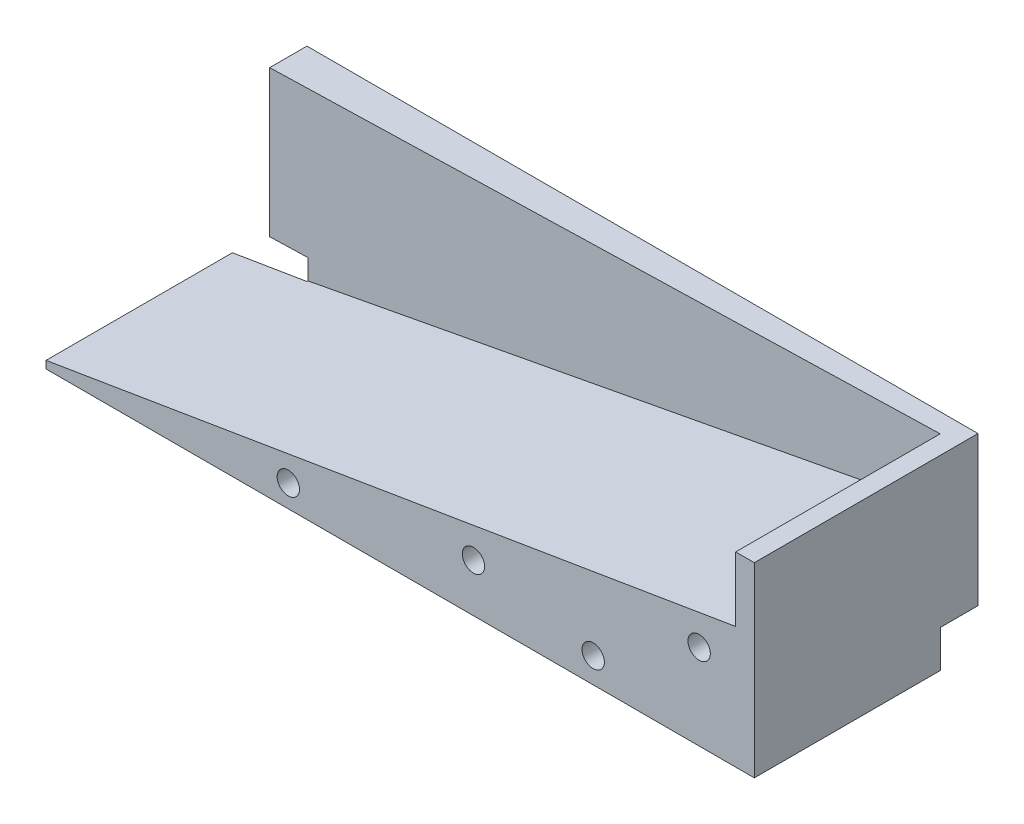
ISO-10303-21;
HEADER;
FILE_DESCRIPTION(('STEP AP214'),'2;1');
FILE_NAME('part.step','',(''),(''),'','','');
FILE_SCHEMA(('AUTOMOTIVE_DESIGN { 1 0 10303 214 1 1 1 1 }'));
ENDSEC;
DATA;
#1=APPLICATION_CONTEXT('core data for automotive mechanical design processes');
#2=APPLICATION_PROTOCOL_DEFINITION('international standard','automotive_design',2000,#1);
#3=PRODUCT_CONTEXT('',#1,'mechanical');
#4=PRODUCT('Part','Part','',(#3));
#5=PRODUCT_RELATED_PRODUCT_CATEGORY('part','',(#4));
#6=PRODUCT_DEFINITION_FORMATION('','',#4);
#7=PRODUCT_DEFINITION_CONTEXT('part definition',#1,'design');
#8=PRODUCT_DEFINITION('design','',#6,#7);
#9=PRODUCT_DEFINITION_SHAPE('','',#8);
#10=(LENGTH_UNIT() NAMED_UNIT(*) SI_UNIT(.MILLI.,.METRE.));
#11=(NAMED_UNIT(*) PLANE_ANGLE_UNIT() SI_UNIT($,.RADIAN.));
#12=(NAMED_UNIT(*) SI_UNIT($,.STERADIAN.) SOLID_ANGLE_UNIT());
#13=UNCERTAINTY_MEASURE_WITH_UNIT(LENGTH_MEASURE(1.E-05),#10,'distance_accuracy_value','');
#14=(GEOMETRIC_REPRESENTATION_CONTEXT(3) GLOBAL_UNCERTAINTY_ASSIGNED_CONTEXT((#13)) GLOBAL_UNIT_ASSIGNED_CONTEXT((#10,
#11,#12)) REPRESENTATION_CONTEXT('',''));
#15=CARTESIAN_POINT('',(0.,0.,0.));
#16=DIRECTION('',(0.,0.,1.));
#17=DIRECTION('',(1.,0.,0.));
#18=AXIS2_PLACEMENT_3D('',#15,#16,#17);
#19=CARTESIAN_POINT('',(-40.7960134047091,6.,200.));
#20=DIRECTION('',(0.,0.,-1.));
#21=DIRECTION('',(-1.,0.,0.));
#22=AXIS2_PLACEMENT_3D('',#19,#20,#21);
#23=CYLINDRICAL_SURFACE('',#22,3.);
#24=CARTESIAN_POINT('',(-40.7960134047091,6.,55.));
#25=DIRECTION('',(0.,0.,-1.));
#26=DIRECTION('',(-1.,0.,0.));
#27=AXIS2_PLACEMENT_3D('',#24,#25,#26);
#28=CIRCLE('',#27,3.);
#29=CARTESIAN_POINT('',(-43.7960134047091,6.,55.));
#30=VERTEX_POINT('',#29);
#31=EDGE_CURVE('E289',#30,#30,#28,.T.);
#32=ORIENTED_EDGE('',*,*,#31,.F.);
#33=EDGE_LOOP('',(#32));
#34=FACE_BOUND('',#33,.T.);
#35=CARTESIAN_POINT('',(-40.7960134047091,6.,10.));
#36=DIRECTION('',(0.,0.,-1.));
#37=DIRECTION('',(-1.,0.,0.));
#38=AXIS2_PLACEMENT_3D('',#35,#36,#37);
#39=CIRCLE('',#38,3.);
#40=CARTESIAN_POINT('',(-43.7960134047091,6.,10.));
#41=VERTEX_POINT('',#40);
#42=EDGE_CURVE('E190',#41,#41,#39,.T.);
#43=ORIENTED_EDGE('',*,*,#42,.T.);
#44=EDGE_LOOP('',(#43));
#45=FACE_BOUND('',#44,.T.);
#46=ADVANCED_FACE('F35',(#34,#45),#23,.F.);
#47=CARTESIAN_POINT('',(8.86154286614935,12.9010851063287,200.));
#48=DIRECTION('',(0.,0.,-1.));
#49=DIRECTION('',(-1.,0.,0.));
#50=AXIS2_PLACEMENT_3D('',#47,#48,#49);
#51=CYLINDRICAL_SURFACE('',#50,3.);
#52=CARTESIAN_POINT('',(8.86154286614935,12.9010851063287,55.));
#53=DIRECTION('',(0.,0.,-1.));
#54=DIRECTION('',(-1.,0.,0.));
#55=AXIS2_PLACEMENT_3D('',#52,#53,#54);
#56=CIRCLE('',#55,3.);
#57=CARTESIAN_POINT('',(5.86154286614935,12.9010851063287,55.));
#58=VERTEX_POINT('',#57);
#59=EDGE_CURVE('E429',#58,#58,#56,.T.);
#60=ORIENTED_EDGE('',*,*,#59,.F.);
#61=EDGE_LOOP('',(#60));
#62=FACE_BOUND('',#61,.T.);
#63=CARTESIAN_POINT('',(8.86154286614935,12.9010851063287,10.));
#64=DIRECTION('',(0.,0.,-1.));
#65=DIRECTION('',(-1.,0.,0.));
#66=AXIS2_PLACEMENT_3D('',#63,#64,#65);
#67=CIRCLE('',#66,3.);
#68=CARTESIAN_POINT('',(5.86154286614935,12.9010851063287,10.));
#69=VERTEX_POINT('',#68);
#70=EDGE_CURVE('E185',#69,#69,#67,.T.);
#71=ORIENTED_EDGE('',*,*,#70,.T.);
#72=EDGE_LOOP('',(#71));
#73=FACE_BOUND('',#72,.T.);
#74=ADVANCED_FACE('F322',(#62,#73),#51,.F.);
#75=CARTESIAN_POINT('',(40.9814690667464,6.77616521020496,200.));
#76=DIRECTION('',(0.,0.,-1.));
#77=DIRECTION('',(-1.,0.,0.));
#78=AXIS2_PLACEMENT_3D('',#75,#76,#77);
#79=CYLINDRICAL_SURFACE('',#78,3.00000000000001);
#80=CARTESIAN_POINT('',(40.9814690667464,6.77616521020496,55.));
#81=DIRECTION('',(0.,0.,-1.));
#82=DIRECTION('',(-1.,0.,0.));
#83=AXIS2_PLACEMENT_3D('',#80,#81,#82);
#84=CIRCLE('',#83,3.00000000000001);
#85=CARTESIAN_POINT('',(37.9814690667464,6.77616521020496,55.));
#86=VERTEX_POINT('',#85);
#87=EDGE_CURVE('E433',#86,#86,#84,.T.);
#88=ORIENTED_EDGE('',*,*,#87,.F.);
#89=EDGE_LOOP('',(#88));
#90=FACE_BOUND('',#89,.T.);
#91=CARTESIAN_POINT('',(40.9814690667464,6.77616521020496,10.));
#92=DIRECTION('',(0.,0.,-1.));
#93=DIRECTION('',(-1.,0.,0.));
#94=AXIS2_PLACEMENT_3D('',#91,#92,#93);
#95=CIRCLE('',#94,3.00000000000001);
#96=CARTESIAN_POINT('',(37.9814690667464,6.77616521020496,10.));
#97=VERTEX_POINT('',#96);
#98=EDGE_CURVE('E180',#97,#97,#95,.T.);
#99=ORIENTED_EDGE('',*,*,#98,.T.);
#100=EDGE_LOOP('',(#99));
#101=FACE_BOUND('',#100,.T.);
#102=ADVANCED_FACE('F329',(#90,#101),#79,.F.);
#103=CARTESIAN_POINT('',(69.4060048708337,22.9393971638675,200.));
#104=DIRECTION('',(0.,0.,-1.));
#105=DIRECTION('',(-1.,0.,0.));
#106=AXIS2_PLACEMENT_3D('',#103,#104,#105);
#107=CYLINDRICAL_SURFACE('',#106,3.00000000000001);
#108=CARTESIAN_POINT('',(69.4060048708337,22.9393971638675,55.));
#109=DIRECTION('',(0.,0.,-1.));
#110=DIRECTION('',(-1.,0.,0.));
#111=AXIS2_PLACEMENT_3D('',#108,#109,#110);
#112=CIRCLE('',#111,3.00000000000001);
#113=CARTESIAN_POINT('',(66.4060048708336,22.9393971638675,55.));
#114=VERTEX_POINT('',#113);
#115=EDGE_CURVE('E436',#114,#114,#112,.T.);
#116=ORIENTED_EDGE('',*,*,#115,.F.);
#117=EDGE_LOOP('',(#116));
#118=FACE_BOUND('',#117,.T.);
#119=CARTESIAN_POINT('',(69.4060048708337,22.9393971638675,10.));
#120=DIRECTION('',(0.,0.,-1.));
#121=DIRECTION('',(-1.,0.,0.));
#122=AXIS2_PLACEMENT_3D('',#119,#120,#121);
#123=CIRCLE('',#122,3.00000000000001);
#124=CARTESIAN_POINT('',(66.4060048708336,22.9393971638675,10.));
#125=VERTEX_POINT('',#124);
#126=EDGE_CURVE('E175',#125,#125,#123,.T.);
#127=ORIENTED_EDGE('',*,*,#126,.T.);
#128=EDGE_LOOP('',(#127));
#129=FACE_BOUND('',#128,.T.);
#130=ADVANCED_FACE('F337',(#118,#129),#107,.F.);
#131=CARTESIAN_POINT('',(-105.796013404709,2.,200.));
#132=DIRECTION('',(0.163567680624933,-0.986532114963816,0.));
#133=DIRECTION('',(0.986532114963816,0.163567680624933,0.));
#134=AXIS2_PLACEMENT_3D('',#131,#132,#133);
#135=PLANE('',#134);
#136=DIRECTION('',(0.,0.,-1.));
#137=VECTOR('',#136,1.);
#138=CARTESIAN_POINT('',(-105.796013404709,2.,200.));
#139=LINE('',#138,#137);
#140=CARTESIAN_POINT('',(-105.796013404709,2.,55.));
#141=VERTEX_POINT('',#140);
#142=CARTESIAN_POINT('',(-105.796013404709,2.,5.));
#143=VERTEX_POINT('',#142);
#144=EDGE_CURVE('E158',#141,#143,#139,.T.);
#145=ORIENTED_EDGE('',*,*,#144,.F.);
#146=DIRECTION('',(0.986532114963816,0.163567680624933,0.));
#147=VECTOR('',#146,1.);
#148=CARTESIAN_POINT('',(-105.796013404709,2.,55.));
#149=LINE('',#148,#147);
#150=CARTESIAN_POINT('',(79.2039865952909,32.6731230100121,55.));
#151=VERTEX_POINT('',#150);
#152=EDGE_CURVE('E437',#141,#151,#149,.T.);
#153=ORIENTED_EDGE('',*,*,#152,.T.);
#154=DIRECTION('',(0.,0.,-1.));
#155=VECTOR('',#154,1.);
#156=CARTESIAN_POINT('',(79.2039865952909,32.6731230100121,217.967909160371));
#157=LINE('',#156,#155);
#158=CARTESIAN_POINT('',(79.2039865952909,32.6731230100121,0.138888888888883));
#159=VERTEX_POINT('',#158);
#160=EDGE_CURVE('E284',#151,#159,#157,.T.);
#161=ORIENTED_EDGE('',*,*,#160,.T.);
#162=DIRECTION('',(-0.986161899831777,-0.163506298709877,0.0273933861064383));
#163=VECTOR('',#162,1.);
#164=CARTESIAN_POINT('',(-111.056300597368,1.12784088579239,5.42389686646275));
#165=LINE('',#164,#163);
#166=CARTESIAN_POINT('',(-85.7960134047091,5.31601329837969,4.72222222222223));
#167=VERTEX_POINT('',#166);
#168=EDGE_CURVE('E195',#159,#167,#165,.T.);
#169=ORIENTED_EDGE('',*,*,#168,.T.);
#170=DIRECTION('',(0.,0.,1.));
#171=VECTOR('',#170,1.);
#172=CARTESIAN_POINT('',(-85.7960134047091,5.31601329837969,200.));
#173=LINE('',#172,#171);
#174=CARTESIAN_POINT('',(-85.7960134047091,5.31601329837969,5.));
#175=VERTEX_POINT('',#174);
#176=EDGE_CURVE('E266',#167,#175,#173,.T.);
#177=ORIENTED_EDGE('',*,*,#176,.T.);
#178=DIRECTION('',(0.986532114963816,0.163567680624933,0.));
#179=VECTOR('',#178,1.);
#180=CARTESIAN_POINT('',(-105.796013404709,2.,5.));
#181=LINE('',#180,#179);
#182=EDGE_CURVE('E261',#143,#175,#181,.T.);
#183=ORIENTED_EDGE('',*,*,#182,.F.);
#184=EDGE_LOOP('',(#145,#153,#161,#169,#177,#183));
#185=FACE_BOUND('',#184,.T.);
#186=ADVANCED_FACE('F341',(#185),#135,.F.);
#187=CARTESIAN_POINT('',(-105.796013404709,0.,200.));
#188=DIRECTION('',(1.,0.,0.));
#189=DIRECTION('',(0.,0.,-1.));
#190=AXIS2_PLACEMENT_3D('',#187,#188,#189);
#191=PLANE('',#190);
#192=DIRECTION('',(0.,0.,-1.));
#193=VECTOR('',#192,1.);
#194=CARTESIAN_POINT('',(-105.796013404709,0.,200.));
#195=LINE('',#194,#193);
#196=CARTESIAN_POINT('',(-105.796013404709,0.,55.));
#197=VERTEX_POINT('',#196);
#198=CARTESIAN_POINT('',(-105.796013404709,0.,5.));
#199=VERTEX_POINT('',#198);
#200=EDGE_CURVE('E168',#197,#199,#195,.T.);
#201=ORIENTED_EDGE('',*,*,#200,.F.);
#202=DIRECTION('',(0.,1.,0.));
#203=VECTOR('',#202,1.);
#204=CARTESIAN_POINT('',(-105.796013404709,-242.074368738204,55.));
#205=LINE('',#204,#203);
#206=EDGE_CURVE('E142',#197,#141,#205,.T.);
#207=ORIENTED_EDGE('',*,*,#206,.T.);
#208=ORIENTED_EDGE('',*,*,#144,.T.);
#209=DIRECTION('',(0.,1.,0.));
#210=VECTOR('',#209,1.);
#211=CARTESIAN_POINT('',(-105.796013404709,0.,5.));
#212=LINE('',#211,#210);
#213=EDGE_CURVE('E248',#199,#143,#212,.T.);
#214=ORIENTED_EDGE('',*,*,#213,.F.);
#215=EDGE_LOOP('',(#201,#207,#208,#214));
#216=FACE_BOUND('',#215,.T.);
#217=ADVANCED_FACE('F37',(#216),#191,.F.);
#218=CARTESIAN_POINT('',(-105.796013404709,0.,200.));
#219=DIRECTION('',(0.,1.,0.));
#220=DIRECTION('',(0.,0.,1.));
#221=AXIS2_PLACEMENT_3D('',#218,#219,#220);
#222=PLANE('',#221);
#223=DIRECTION('',(0.,0.,-1.));
#224=VECTOR('',#223,1.);
#225=CARTESIAN_POINT('',(84.2039865952909,0.,200.));
#226=LINE('',#225,#224);
#227=CARTESIAN_POINT('',(84.2039865952909,0.,55.));
#228=VERTEX_POINT('',#227);
#229=CARTESIAN_POINT('',(84.2039865952909,0.,5.));
#230=VERTEX_POINT('',#229);
#231=EDGE_CURVE('E161',#228,#230,#226,.T.);
#232=ORIENTED_EDGE('',*,*,#231,.F.);
#233=DIRECTION('',(1.,0.,0.));
#234=VECTOR('',#233,1.);
#235=CARTESIAN_POINT('',(84.2039865952909,0.,55.));
#236=LINE('',#235,#234);
#237=EDGE_CURVE('E138',#197,#228,#236,.T.);
#238=ORIENTED_EDGE('',*,*,#237,.F.);
#239=ORIENTED_EDGE('',*,*,#200,.T.);
#240=DIRECTION('',(-1.,0.,0.));
#241=VECTOR('',#240,1.);
#242=CARTESIAN_POINT('',(-105.796013404709,0.,5.));
#243=LINE('',#242,#241);
#244=CARTESIAN_POINT('',(-85.7960134047091,0.,5.));
#245=VERTEX_POINT('',#244);
#246=EDGE_CURVE('E253',#245,#199,#243,.T.);
#247=ORIENTED_EDGE('',*,*,#246,.F.);
#248=DIRECTION('',(0.,0.,-1.));
#249=VECTOR('',#248,1.);
#250=CARTESIAN_POINT('',(-85.7960134047091,0.,5.));
#251=LINE('',#250,#249);
#252=CARTESIAN_POINT('',(-85.7960134047091,0.,-5.));
#253=VERTEX_POINT('',#252);
#254=EDGE_CURVE('E217',#245,#253,#251,.T.);
#255=ORIENTED_EDGE('',*,*,#254,.T.);
#256=DIRECTION('',(1.,0.,0.));
#257=VECTOR('',#256,1.);
#258=CARTESIAN_POINT('',(-95.7960134047091,0.,-5.));
#259=LINE('',#258,#257);
#260=CARTESIAN_POINT('',(74.2039865952908,0.,-5.));
#261=VERTEX_POINT('',#260);
#262=EDGE_CURVE('E163',#253,#261,#259,.T.);
#263=ORIENTED_EDGE('',*,*,#262,.T.);
#264=DIRECTION('',(0.,0.,-1.));
#265=VECTOR('',#264,1.);
#266=CARTESIAN_POINT('',(74.2039865952909,0.,-5.));
#267=LINE('',#266,#265);
#268=CARTESIAN_POINT('',(74.2039865952909,0.,5.));
#269=VERTEX_POINT('',#268);
#270=EDGE_CURVE('E57',#269,#261,#267,.T.);
#271=ORIENTED_EDGE('',*,*,#270,.F.);
#272=DIRECTION('',(1.,0.,0.));
#273=VECTOR('',#272,1.);
#274=CARTESIAN_POINT('',(74.2039865952909,0.,5.));
#275=LINE('',#274,#273);
#276=EDGE_CURVE('E242',#269,#230,#275,.T.);
#277=ORIENTED_EDGE('',*,*,#276,.T.);
#278=EDGE_LOOP('',(#232,#238,#239,#247,#255,#263,#271,#277));
#279=FACE_BOUND('',#278,.T.);
#280=ADVANCED_FACE('F213',(#279),#222,.F.);
#281=CARTESIAN_POINT('',(84.2039865952909,0.,200.));
#282=DIRECTION('',(-1.,0.,0.));
#283=DIRECTION('',(0.,0.,1.));
#284=AXIS2_PLACEMENT_3D('',#281,#282,#283);
#285=PLANE('',#284);
#286=DIRECTION('',(0.,0.,1.));
#287=VECTOR('',#286,1.);
#288=CARTESIAN_POINT('',(84.2039865952909,50.,200.));
#289=LINE('',#288,#287);
#290=CARTESIAN_POINT('',(84.2039865952909,50.,-5.));
#291=VERTEX_POINT('',#290);
#292=CARTESIAN_POINT('',(84.2039865952909,50.,55.));
#293=VERTEX_POINT('',#292);
#294=EDGE_CURVE('E148',#291,#293,#289,.T.);
#295=ORIENTED_EDGE('',*,*,#294,.T.);
#296=DIRECTION('',(0.,1.,0.));
#297=VECTOR('',#296,1.);
#298=CARTESIAN_POINT('',(84.2039865952909,-242.074368738204,55.));
#299=LINE('',#298,#297);
#300=EDGE_CURVE('E135',#228,#293,#299,.T.);
#301=ORIENTED_EDGE('',*,*,#300,.F.);
#302=ORIENTED_EDGE('',*,*,#231,.T.);
#303=DIRECTION('',(0.,-1.,0.));
#304=VECTOR('',#303,1.);
#305=CARTESIAN_POINT('',(84.2039865952909,0.,5.));
#306=LINE('',#305,#304);
#307=CARTESIAN_POINT('',(84.2039865952909,10.,5.));
#308=VERTEX_POINT('',#307);
#309=EDGE_CURVE('E229',#308,#230,#306,.T.);
#310=ORIENTED_EDGE('',*,*,#309,.F.);
#311=DIRECTION('',(0.,0.,1.));
#312=VECTOR('',#311,1.);
#313=CARTESIAN_POINT('',(84.2039865952909,10.,-5.));
#314=LINE('',#313,#312);
#315=CARTESIAN_POINT('',(84.2039865952909,10.,-5.));
#316=VERTEX_POINT('',#315);
#317=EDGE_CURVE('E178',#316,#308,#314,.T.);
#318=ORIENTED_EDGE('',*,*,#317,.F.);
#319=DIRECTION('',(0.,1.,0.));
#320=VECTOR('',#319,1.);
#321=CARTESIAN_POINT('',(84.2039865952909,0.,-5.));
#322=LINE('',#321,#320);
#323=EDGE_CURVE('E156',#316,#291,#322,.T.);
#324=ORIENTED_EDGE('',*,*,#323,.T.);
#325=EDGE_LOOP('',(#295,#301,#302,#310,#318,#324));
#326=FACE_BOUND('',#325,.T.);
#327=ADVANCED_FACE('F153',(#326),#285,.F.);
#328=CARTESIAN_POINT('',(-95.7960134047091,50.,200.));
#329=DIRECTION('',(0.,1.,0.));
#330=DIRECTION('',(0.,0.,1.));
#331=AXIS2_PLACEMENT_3D('',#328,#329,#330);
#332=PLANE('',#331);
#333=DIRECTION('',(-1.,0.,0.));
#334=VECTOR('',#333,1.);
#335=CARTESIAN_POINT('',(84.2039865952909,50.,55.));
#336=LINE('',#335,#334);
#337=CARTESIAN_POINT('',(79.2039865952909,50.,55.));
#338=VERTEX_POINT('',#337);
#339=EDGE_CURVE('E49',#293,#338,#336,.T.);
#340=ORIENTED_EDGE('',*,*,#339,.F.);
#341=ORIENTED_EDGE('',*,*,#294,.F.);
#342=DIRECTION('',(1.,0.,0.));
#343=VECTOR('',#342,1.);
#344=CARTESIAN_POINT('',(-95.7960134047091,50.,-5.));
#345=LINE('',#344,#343);
#346=CARTESIAN_POINT('',(-95.7960134047091,50.,-5.));
#347=VERTEX_POINT('',#346);
#348=EDGE_CURVE('E159',#347,#291,#345,.T.);
#349=ORIENTED_EDGE('',*,*,#348,.F.);
#350=DIRECTION('',(0.,0.,1.));
#351=VECTOR('',#350,1.);
#352=CARTESIAN_POINT('',(-95.7960134047091,50.,0.));
#353=LINE('',#352,#351);
#354=CARTESIAN_POINT('',(-95.7960134047091,50.,5.));
#355=VERTEX_POINT('',#354);
#356=EDGE_CURVE('E204',#347,#355,#353,.T.);
#357=ORIENTED_EDGE('',*,*,#356,.T.);
#358=DIRECTION('',(0.999614420652718,0.,-0.0277670672403533));
#359=VECTOR('',#358,1.);
#360=CARTESIAN_POINT('',(-95.7960134047091,50.,5.));
#361=LINE('',#360,#359);
#362=CARTESIAN_POINT('',(79.2039865952909,50.,0.138888888888885));
#363=VERTEX_POINT('',#362);
#364=EDGE_CURVE('E268',#355,#363,#361,.T.);
#365=ORIENTED_EDGE('',*,*,#364,.T.);
#366=DIRECTION('',(0.,0.,-1.));
#367=VECTOR('',#366,1.);
#368=CARTESIAN_POINT('',(79.2039865952909,50.,217.967909160371));
#369=LINE('',#368,#367);
#370=EDGE_CURVE('E151',#338,#363,#369,.T.);
#371=ORIENTED_EDGE('',*,*,#370,.F.);
#372=EDGE_LOOP('',(#340,#341,#349,#357,#365,#371));
#373=FACE_BOUND('',#372,.T.);
#374=ADVANCED_FACE('F146',(#373),#332,.T.);
#375=CARTESIAN_POINT('',(-95.7960134047091,0.,0.));
#376=DIRECTION('',(-1.,0.,0.));
#377=DIRECTION('',(0.,0.,1.));
#378=AXIS2_PLACEMENT_3D('',#375,#376,#377);
#379=PLANE('',#378);
#380=DIRECTION('',(0.,0.,-1.));
#381=VECTOR('',#380,1.);
#382=CARTESIAN_POINT('',(-95.7960134047091,10.7198341627884,0.));
#383=LINE('',#382,#381);
#384=CARTESIAN_POINT('',(-95.7960134047091,10.7198341627884,5.));
#385=VERTEX_POINT('',#384);
#386=CARTESIAN_POINT('',(-95.7960134047091,10.7198341627884,-5.));
#387=VERTEX_POINT('',#386);
#388=EDGE_CURVE('E264',#385,#387,#383,.T.);
#389=ORIENTED_EDGE('',*,*,#388,.F.);
#390=DIRECTION('',(0.,1.,0.));
#391=VECTOR('',#390,1.);
#392=CARTESIAN_POINT('',(-95.7960134047091,-180.069431053691,5.));
#393=LINE('',#392,#391);
#394=EDGE_CURVE('E197',#385,#355,#393,.T.);
#395=ORIENTED_EDGE('',*,*,#394,.T.);
#396=ORIENTED_EDGE('',*,*,#356,.F.);
#397=DIRECTION('',(0.,1.,0.));
#398=VECTOR('',#397,1.);
#399=CARTESIAN_POINT('',(-95.7960134047091,0.,-5.));
#400=LINE('',#399,#398);
#401=EDGE_CURVE('E202',#387,#347,#400,.T.);
#402=ORIENTED_EDGE('',*,*,#401,.F.);
#403=EDGE_LOOP('',(#389,#395,#396,#402));
#404=FACE_BOUND('',#403,.T.);
#405=ADVANCED_FACE('F272',(#404),#379,.T.);
#406=CARTESIAN_POINT('',(-95.7960134047091,0.,-5.));
#407=DIRECTION('',(0.,0.,-1.));
#408=DIRECTION('',(-1.,0.,0.));
#409=AXIS2_PLACEMENT_3D('',#406,#407,#408);
#410=PLANE('',#409);
#411=ORIENTED_EDGE('',*,*,#348,.T.);
#412=ORIENTED_EDGE('',*,*,#323,.F.);
#413=DIRECTION('',(1.,0.,0.));
#414=VECTOR('',#413,1.);
#415=CARTESIAN_POINT('',(74.2039865952909,10.,-5.));
#416=LINE('',#415,#414);
#417=CARTESIAN_POINT('',(74.2039865952909,10.,-5.));
#418=VERTEX_POINT('',#417);
#419=EDGE_CURVE('E226',#418,#316,#416,.T.);
#420=ORIENTED_EDGE('',*,*,#419,.F.);
#421=DIRECTION('',(0.,1.,0.));
#422=VECTOR('',#421,1.);
#423=CARTESIAN_POINT('',(74.2039865952909,0.,-5.));
#424=LINE('',#423,#422);
#425=EDGE_CURVE('E225',#261,#418,#424,.T.);
#426=ORIENTED_EDGE('',*,*,#425,.F.);
#427=ORIENTED_EDGE('',*,*,#262,.F.);
#428=DIRECTION('',(0.,-1.,0.));
#429=VECTOR('',#428,1.);
#430=CARTESIAN_POINT('',(-85.7960134047091,0.,-5.));
#431=LINE('',#430,#429);
#432=CARTESIAN_POINT('',(-85.7960134047091,10.7198341627884,-5.));
#433=VERTEX_POINT('',#432);
#434=EDGE_CURVE('E223',#433,#253,#431,.T.);
#435=ORIENTED_EDGE('',*,*,#434,.F.);
#436=DIRECTION('',(1.,0.,0.));
#437=VECTOR('',#436,1.);
#438=CARTESIAN_POINT('',(-105.796013404709,10.7198341627884,-5.));
#439=LINE('',#438,#437);
#440=EDGE_CURVE('E244',#387,#433,#439,.T.);
#441=ORIENTED_EDGE('',*,*,#440,.F.);
#442=ORIENTED_EDGE('',*,*,#401,.T.);
#443=EDGE_LOOP('',(#411,#412,#420,#426,#427,#435,#441,#442));
#444=FACE_BOUND('',#443,.T.);
#445=CARTESIAN_POINT('',(-40.7960134047091,6.,-5.));
#446=DIRECTION('',(0.,0.,-1.));
#447=DIRECTION('',(-1.,0.,0.));
#448=AXIS2_PLACEMENT_3D('',#445,#446,#447);
#449=CIRCLE('',#448,5.);
#450=CARTESIAN_POINT('',(-45.7960134047091,6.,-5.));
#451=VERTEX_POINT('',#450);
#452=EDGE_CURVE('E285',#451,#451,#449,.T.);
#453=ORIENTED_EDGE('',*,*,#452,.F.);
#454=EDGE_LOOP('',(#453));
#455=FACE_BOUND('',#454,.T.);
#456=CARTESIAN_POINT('',(8.86154286614935,12.9010851063287,-5.));
#457=DIRECTION('',(0.,0.,-1.));
#458=DIRECTION('',(-1.,0.,0.));
#459=AXIS2_PLACEMENT_3D('',#456,#457,#458);
#460=CIRCLE('',#459,5.);
#461=CARTESIAN_POINT('',(3.86154286614935,12.9010851063287,-5.));
#462=VERTEX_POINT('',#461);
#463=EDGE_CURVE('E193',#462,#462,#460,.T.);
#464=ORIENTED_EDGE('',*,*,#463,.F.);
#465=EDGE_LOOP('',(#464));
#466=FACE_BOUND('',#465,.T.);
#467=CARTESIAN_POINT('',(40.9814690667464,6.77616521020496,-5.));
#468=DIRECTION('',(0.,0.,-1.));
#469=DIRECTION('',(-1.,0.,0.));
#470=AXIS2_PLACEMENT_3D('',#467,#468,#469);
#471=CIRCLE('',#470,5.);
#472=CARTESIAN_POINT('',(35.9814690667464,6.77616521020496,-5.));
#473=VERTEX_POINT('',#472);
#474=EDGE_CURVE('E188',#473,#473,#471,.T.);
#475=ORIENTED_EDGE('',*,*,#474,.F.);
#476=EDGE_LOOP('',(#475));
#477=FACE_BOUND('',#476,.T.);
#478=CARTESIAN_POINT('',(69.4060048708337,22.9393971638675,-5.));
#479=DIRECTION('',(0.,0.,-1.));
#480=DIRECTION('',(-1.,0.,0.));
#481=AXIS2_PLACEMENT_3D('',#478,#479,#480);
#482=CIRCLE('',#481,5.);
#483=CARTESIAN_POINT('',(64.4060048708336,22.9393971638675,-5.));
#484=VERTEX_POINT('',#483);
#485=EDGE_CURVE('E183',#484,#484,#482,.T.);
#486=ORIENTED_EDGE('',*,*,#485,.F.);
#487=EDGE_LOOP('',(#486));
#488=FACE_BOUND('',#487,.T.);
#489=ADVANCED_FACE('F220',(#444,#455,#466,#477,#488),#410,.T.);
#490=CARTESIAN_POINT('',(-95.7960134047091,-180.069431053691,5.));
#491=DIRECTION('',(0.0277670672403533,0.,0.999614420652718));
#492=DIRECTION('',(0.999614420652718,0.,-0.0277670672403533));
#493=AXIS2_PLACEMENT_3D('',#490,#491,#492);
#494=PLANE('',#493);
#495=DIRECTION('',(0.,-1.,0.));
#496=VECTOR('',#495,1.);
#497=CARTESIAN_POINT('',(79.2039865952909,-180.069431053691,0.138888888888888));
#498=LINE('',#497,#496);
#499=EDGE_CURVE('E43',#363,#159,#498,.T.);
#500=ORIENTED_EDGE('',*,*,#499,.F.);
#501=ORIENTED_EDGE('',*,*,#364,.F.);
#502=ORIENTED_EDGE('',*,*,#394,.F.);
#503=DIRECTION('',(-0.999614420652718,0.,0.0277670672403533));
#504=VECTOR('',#503,1.);
#505=CARTESIAN_POINT('',(-95.7960134047091,10.7198341627884,5.));
#506=LINE('',#505,#504);
#507=CARTESIAN_POINT('',(-85.7960134047091,10.7198341627884,4.72222222222222));
#508=VERTEX_POINT('',#507);
#509=EDGE_CURVE('E170',#508,#385,#506,.T.);
#510=ORIENTED_EDGE('',*,*,#509,.F.);
#511=DIRECTION('',(0.,1.,0.));
#512=VECTOR('',#511,1.);
#513=CARTESIAN_POINT('',(-85.7960134047091,-180.069431053691,4.72222222222222));
#514=LINE('',#513,#512);
#515=EDGE_CURVE('E172',#167,#508,#514,.T.);
#516=ORIENTED_EDGE('',*,*,#515,.F.);
#517=ORIENTED_EDGE('',*,*,#168,.F.);
#518=EDGE_LOOP('',(#500,#501,#502,#510,#516,#517));
#519=FACE_BOUND('',#518,.T.);
#520=ADVANCED_FACE('F277',(#519),#494,.T.);
#521=CARTESIAN_POINT('',(-85.7960134047091,0.,5.));
#522=DIRECTION('',(1.,0.,0.));
#523=DIRECTION('',(0.,0.,-1.));
#524=AXIS2_PLACEMENT_3D('',#521,#522,#523);
#525=PLANE('',#524);
#526=ORIENTED_EDGE('',*,*,#515,.T.);
#527=DIRECTION('',(0.,0.,-1.));
#528=VECTOR('',#527,1.);
#529=CARTESIAN_POINT('',(-85.7960134047091,10.7198341627884,5.));
#530=LINE('',#529,#528);
#531=EDGE_CURVE('E256',#508,#433,#530,.T.);
#532=ORIENTED_EDGE('',*,*,#531,.T.);
#533=ORIENTED_EDGE('',*,*,#434,.T.);
#534=ORIENTED_EDGE('',*,*,#254,.F.);
#535=DIRECTION('',(0.,-1.,0.));
#536=VECTOR('',#535,1.);
#537=CARTESIAN_POINT('',(-85.7960134047091,0.,5.));
#538=LINE('',#537,#536);
#539=EDGE_CURVE('E251',#175,#245,#538,.T.);
#540=ORIENTED_EDGE('',*,*,#539,.F.);
#541=ORIENTED_EDGE('',*,*,#176,.F.);
#542=EDGE_LOOP('',(#526,#532,#533,#534,#540,#541));
#543=FACE_BOUND('',#542,.T.);
#544=ADVANCED_FACE('F317',(#543),#525,.F.);
#545=CARTESIAN_POINT('',(0.,0.,5.));
#546=DIRECTION('',(0.,0.,-1.));
#547=DIRECTION('',(-1.,0.,0.));
#548=AXIS2_PLACEMENT_3D('',#545,#546,#547);
#549=PLANE('',#548);
#550=ORIENTED_EDGE('',*,*,#182,.T.);
#551=ORIENTED_EDGE('',*,*,#539,.T.);
#552=ORIENTED_EDGE('',*,*,#246,.T.);
#553=ORIENTED_EDGE('',*,*,#213,.T.);
#554=EDGE_LOOP('',(#550,#551,#552,#553));
#555=FACE_BOUND('',#554,.T.);
#556=ADVANCED_FACE('F359',(#555),#549,.T.);
#557=CARTESIAN_POINT('',(-105.796013404709,10.7198341627884,5.));
#558=DIRECTION('',(0.,1.,0.));
#559=DIRECTION('',(0.,0.,1.));
#560=AXIS2_PLACEMENT_3D('',#557,#558,#559);
#561=PLANE('',#560);
#562=ORIENTED_EDGE('',*,*,#388,.T.);
#563=ORIENTED_EDGE('',*,*,#440,.T.);
#564=ORIENTED_EDGE('',*,*,#531,.F.);
#565=ORIENTED_EDGE('',*,*,#509,.T.);
#566=EDGE_LOOP('',(#562,#563,#564,#565));
#567=FACE_BOUND('',#566,.T.);
#568=ADVANCED_FACE('F365',(#567),#561,.F.);
#569=CARTESIAN_POINT('',(74.2039865952909,0.,5.));
#570=DIRECTION('',(0.,0.,1.));
#571=DIRECTION('',(1.,0.,0.));
#572=AXIS2_PLACEMENT_3D('',#569,#570,#571);
#573=PLANE('',#572);
#574=ORIENTED_EDGE('',*,*,#309,.T.);
#575=ORIENTED_EDGE('',*,*,#276,.F.);
#576=DIRECTION('',(0.,-1.,0.));
#577=VECTOR('',#576,1.);
#578=CARTESIAN_POINT('',(74.2039865952909,0.,5.));
#579=LINE('',#578,#577);
#580=CARTESIAN_POINT('',(74.2039865952909,10.,5.));
#581=VERTEX_POINT('',#580);
#582=EDGE_CURVE('E231',#581,#269,#579,.T.);
#583=ORIENTED_EDGE('',*,*,#582,.F.);
#584=DIRECTION('',(1.,0.,0.));
#585=VECTOR('',#584,1.);
#586=CARTESIAN_POINT('',(74.2039865952909,10.,5.));
#587=LINE('',#586,#585);
#588=EDGE_CURVE('E245',#581,#308,#587,.T.);
#589=ORIENTED_EDGE('',*,*,#588,.T.);
#590=EDGE_LOOP('',(#574,#575,#583,#589));
#591=FACE_BOUND('',#590,.T.);
#592=ADVANCED_FACE('F367',(#591),#573,.F.);
#593=CARTESIAN_POINT('',(74.2039865952909,10.,-5.));
#594=DIRECTION('',(0.,1.,0.));
#595=DIRECTION('',(0.,0.,1.));
#596=AXIS2_PLACEMENT_3D('',#593,#594,#595);
#597=PLANE('',#596);
#598=ORIENTED_EDGE('',*,*,#317,.T.);
#599=ORIENTED_EDGE('',*,*,#588,.F.);
#600=DIRECTION('',(0.,0.,1.));
#601=VECTOR('',#600,1.);
#602=CARTESIAN_POINT('',(74.2039865952909,10.,-5.));
#603=LINE('',#602,#601);
#604=EDGE_CURVE('E228',#418,#581,#603,.T.);
#605=ORIENTED_EDGE('',*,*,#604,.F.);
#606=ORIENTED_EDGE('',*,*,#419,.T.);
#607=EDGE_LOOP('',(#598,#599,#605,#606));
#608=FACE_BOUND('',#607,.T.);
#609=ADVANCED_FACE('F373',(#608),#597,.F.);
#610=CARTESIAN_POINT('',(74.2039865952909,0.,0.));
#611=DIRECTION('',(1.,0.,0.));
#612=DIRECTION('',(0.,0.,-1.));
#613=AXIS2_PLACEMENT_3D('',#610,#611,#612);
#614=PLANE('',#613);
#615=ORIENTED_EDGE('',*,*,#425,.T.);
#616=ORIENTED_EDGE('',*,*,#604,.T.);
#617=ORIENTED_EDGE('',*,*,#582,.T.);
#618=ORIENTED_EDGE('',*,*,#270,.T.);
#619=EDGE_LOOP('',(#615,#616,#617,#618));
#620=FACE_BOUND('',#619,.T.);
#621=ADVANCED_FACE('F381',(#620),#614,.T.);
#622=CARTESIAN_POINT('',(69.4060048708337,22.9393971638675,10.));
#623=DIRECTION('',(0.,0.,-1.));
#624=DIRECTION('',(-1.,0.,0.));
#625=AXIS2_PLACEMENT_3D('',#622,#623,#624);
#626=CYLINDRICAL_SURFACE('',#625,5.);
#627=CARTESIAN_POINT('',(69.4060048708337,22.9393971638675,10.));
#628=DIRECTION('',(0.,0.,-1.));
#629=DIRECTION('',(-1.,0.,0.));
#630=AXIS2_PLACEMENT_3D('',#627,#628,#629);
#631=CIRCLE('',#630,5.);
#632=CARTESIAN_POINT('',(64.4060048708336,22.9393971638675,10.));
#633=VERTEX_POINT('',#632);
#634=EDGE_CURVE('E179',#633,#633,#631,.T.);
#635=ORIENTED_EDGE('',*,*,#634,.F.);
#636=EDGE_LOOP('',(#635));
#637=FACE_BOUND('',#636,.T.);
#638=ORIENTED_EDGE('',*,*,#485,.T.);
#639=EDGE_LOOP('',(#638));
#640=FACE_BOUND('',#639,.T.);
#641=ADVANCED_FACE('F309',(#637,#640),#626,.F.);
#642=CARTESIAN_POINT('',(69.4060048708337,22.9393971638675,10.));
#643=DIRECTION('',(0.,0.,-1.));
#644=DIRECTION('',(-1.,0.,0.));
#645=AXIS2_PLACEMENT_3D('',#642,#643,#644);
#646=PLANE('',#645);
#647=ORIENTED_EDGE('',*,*,#126,.F.);
#648=EDGE_LOOP('',(#647));
#649=FACE_BOUND('',#648,.T.);
#650=ORIENTED_EDGE('',*,*,#634,.T.);
#651=EDGE_LOOP('',(#650));
#652=FACE_BOUND('',#651,.T.);
#653=ADVANCED_FACE('F388',(#649,#652),#646,.T.);
#654=CARTESIAN_POINT('',(40.9814690667464,6.77616521020496,10.));
#655=DIRECTION('',(0.,0.,-1.));
#656=DIRECTION('',(-1.,0.,0.));
#657=AXIS2_PLACEMENT_3D('',#654,#655,#656);
#658=CYLINDRICAL_SURFACE('',#657,5.);
#659=CARTESIAN_POINT('',(40.9814690667464,6.77616521020496,10.));
#660=DIRECTION('',(0.,0.,-1.));
#661=DIRECTION('',(-1.,0.,0.));
#662=AXIS2_PLACEMENT_3D('',#659,#660,#661);
#663=CIRCLE('',#662,5.);
#664=CARTESIAN_POINT('',(35.9814690667464,6.77616521020496,10.));
#665=VERTEX_POINT('',#664);
#666=EDGE_CURVE('E184',#665,#665,#663,.T.);
#667=ORIENTED_EDGE('',*,*,#666,.F.);
#668=EDGE_LOOP('',(#667));
#669=FACE_BOUND('',#668,.T.);
#670=ORIENTED_EDGE('',*,*,#474,.T.);
#671=EDGE_LOOP('',(#670));
#672=FACE_BOUND('',#671,.T.);
#673=ADVANCED_FACE('F392',(#669,#672),#658,.F.);
#674=CARTESIAN_POINT('',(40.9814690667464,6.77616521020496,10.));
#675=DIRECTION('',(0.,0.,-1.));
#676=DIRECTION('',(-1.,0.,0.));
#677=AXIS2_PLACEMENT_3D('',#674,#675,#676);
#678=PLANE('',#677);
#679=ORIENTED_EDGE('',*,*,#98,.F.);
#680=EDGE_LOOP('',(#679));
#681=FACE_BOUND('',#680,.T.);
#682=ORIENTED_EDGE('',*,*,#666,.T.);
#683=EDGE_LOOP('',(#682));
#684=FACE_BOUND('',#683,.T.);
#685=ADVANCED_FACE('F396',(#681,#684),#678,.T.);
#686=CARTESIAN_POINT('',(8.86154286614935,12.9010851063287,10.));
#687=DIRECTION('',(0.,0.,-1.));
#688=DIRECTION('',(-1.,0.,0.));
#689=AXIS2_PLACEMENT_3D('',#686,#687,#688);
#690=CYLINDRICAL_SURFACE('',#689,5.);
#691=CARTESIAN_POINT('',(8.86154286614935,12.9010851063287,10.));
#692=DIRECTION('',(0.,0.,-1.));
#693=DIRECTION('',(-1.,0.,0.));
#694=AXIS2_PLACEMENT_3D('',#691,#692,#693);
#695=CIRCLE('',#694,5.);
#696=CARTESIAN_POINT('',(3.86154286614935,12.9010851063287,10.));
#697=VERTEX_POINT('',#696);
#698=EDGE_CURVE('E189',#697,#697,#695,.T.);
#699=ORIENTED_EDGE('',*,*,#698,.F.);
#700=EDGE_LOOP('',(#699));
#701=FACE_BOUND('',#700,.T.);
#702=ORIENTED_EDGE('',*,*,#463,.T.);
#703=EDGE_LOOP('',(#702));
#704=FACE_BOUND('',#703,.T.);
#705=ADVANCED_FACE('F400',(#701,#704),#690,.F.);
#706=CARTESIAN_POINT('',(8.86154286614935,12.9010851063287,10.));
#707=DIRECTION('',(0.,0.,-1.));
#708=DIRECTION('',(-1.,0.,0.));
#709=AXIS2_PLACEMENT_3D('',#706,#707,#708);
#710=PLANE('',#709);
#711=ORIENTED_EDGE('',*,*,#70,.F.);
#712=EDGE_LOOP('',(#711));
#713=FACE_BOUND('',#712,.T.);
#714=ORIENTED_EDGE('',*,*,#698,.T.);
#715=EDGE_LOOP('',(#714));
#716=FACE_BOUND('',#715,.T.);
#717=ADVANCED_FACE('F404',(#713,#716),#710,.T.);
#718=CARTESIAN_POINT('',(-40.7960134047091,6.,10.));
#719=DIRECTION('',(0.,0.,-1.));
#720=DIRECTION('',(-1.,0.,0.));
#721=AXIS2_PLACEMENT_3D('',#718,#719,#720);
#722=CYLINDRICAL_SURFACE('',#721,5.);
#723=CARTESIAN_POINT('',(-40.7960134047091,6.,10.));
#724=DIRECTION('',(0.,0.,-1.));
#725=DIRECTION('',(-1.,0.,0.));
#726=AXIS2_PLACEMENT_3D('',#723,#724,#725);
#727=CIRCLE('',#726,5.);
#728=CARTESIAN_POINT('',(-45.7960134047091,6.,10.));
#729=VERTEX_POINT('',#728);
#730=EDGE_CURVE('E194',#729,#729,#727,.T.);
#731=ORIENTED_EDGE('',*,*,#730,.F.);
#732=EDGE_LOOP('',(#731));
#733=FACE_BOUND('',#732,.T.);
#734=ORIENTED_EDGE('',*,*,#452,.T.);
#735=EDGE_LOOP('',(#734));
#736=FACE_BOUND('',#735,.T.);
#737=ADVANCED_FACE('F408',(#733,#736),#722,.F.);
#738=CARTESIAN_POINT('',(-40.7960134047091,6.,10.));
#739=DIRECTION('',(0.,0.,-1.));
#740=DIRECTION('',(-1.,0.,0.));
#741=AXIS2_PLACEMENT_3D('',#738,#739,#740);
#742=PLANE('',#741);
#743=ORIENTED_EDGE('',*,*,#42,.F.);
#744=EDGE_LOOP('',(#743));
#745=FACE_BOUND('',#744,.T.);
#746=ORIENTED_EDGE('',*,*,#730,.T.);
#747=EDGE_LOOP('',(#746));
#748=FACE_BOUND('',#747,.T.);
#749=ADVANCED_FACE('F412',(#745,#748),#742,.T.);
#750=CARTESIAN_POINT('',(79.2039865952909,32.6731230100121,217.967909160371));
#751=DIRECTION('',(-1.,0.,0.));
#752=DIRECTION('',(0.,0.,1.));
#753=AXIS2_PLACEMENT_3D('',#750,#751,#752);
#754=PLANE('',#753);
#755=DIRECTION('',(0.,-1.,0.));
#756=VECTOR('',#755,1.);
#757=CARTESIAN_POINT('',(79.2039865952909,32.6731230100121,55.));
#758=LINE('',#757,#756);
#759=EDGE_CURVE('E11',#338,#151,#758,.T.);
#760=ORIENTED_EDGE('',*,*,#759,.F.);
#761=ORIENTED_EDGE('',*,*,#370,.T.);
#762=ORIENTED_EDGE('',*,*,#499,.T.);
#763=ORIENTED_EDGE('',*,*,#160,.F.);
#764=EDGE_LOOP('',(#760,#761,#762,#763));
#765=FACE_BOUND('',#764,.T.);
#766=ADVANCED_FACE('F283',(#765),#754,.T.);
#767=CARTESIAN_POINT('',(84.2039865952909,-242.074368738204,55.));
#768=DIRECTION('',(0.,0.,-1.));
#769=DIRECTION('',(-1.,0.,0.));
#770=AXIS2_PLACEMENT_3D('',#767,#768,#769);
#771=PLANE('',#770);
#772=ORIENTED_EDGE('',*,*,#31,.T.);
#773=EDGE_LOOP('',(#772));
#774=FACE_BOUND('',#773,.T.);
#775=ORIENTED_EDGE('',*,*,#59,.T.);
#776=EDGE_LOOP('',(#775));
#777=FACE_BOUND('',#776,.T.);
#778=ORIENTED_EDGE('',*,*,#87,.T.);
#779=EDGE_LOOP('',(#778));
#780=FACE_BOUND('',#779,.T.);
#781=ORIENTED_EDGE('',*,*,#115,.T.);
#782=EDGE_LOOP('',(#781));
#783=FACE_BOUND('',#782,.T.);
#784=ORIENTED_EDGE('',*,*,#206,.F.);
#785=ORIENTED_EDGE('',*,*,#237,.T.);
#786=ORIENTED_EDGE('',*,*,#300,.T.);
#787=ORIENTED_EDGE('',*,*,#339,.T.);
#788=ORIENTED_EDGE('',*,*,#759,.T.);
#789=ORIENTED_EDGE('',*,*,#152,.F.);
#790=EDGE_LOOP('',(#784,#785,#786,#787,#788,#789));
#791=FACE_BOUND('',#790,.T.);
#792=ADVANCED_FACE('F136',(#774,#777,#780,#783,#791),#771,.F.);
#793=CLOSED_SHELL('',(#46,#74,#102,#130,#186,#217,#280,#327,#374,#405,#489,#520,#544,#556,#568,
#592,#609,#621,#641,#653,#673,#685,#705,#717,#737,#749,#766,#792));
#794=MANIFOLD_SOLID_BREP('B2',#793);
#795=ADVANCED_BREP_SHAPE_REPRESENTATION('',(#18,#794),#14);
#796=SHAPE_DEFINITION_REPRESENTATION(#9,#795);
ENDSEC;
END-ISO-10303-21;
